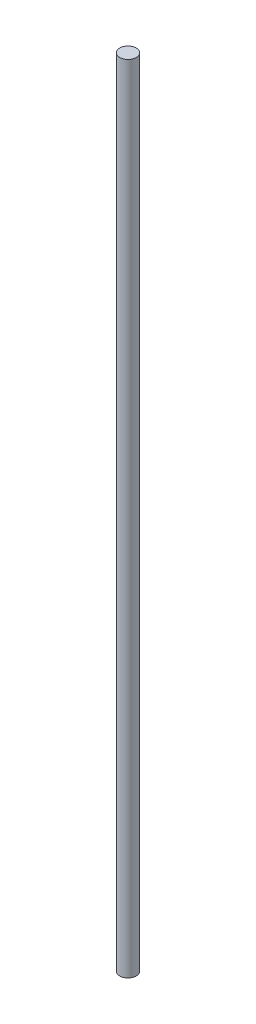
ISO-10303-21;
HEADER;
FILE_DESCRIPTION(('STEP AP214'),'2;1');
FILE_NAME('part.step','',(''),(''),'','','');
FILE_SCHEMA(('AUTOMOTIVE_DESIGN { 1 0 10303 214 1 1 1 1 }'));
ENDSEC;
DATA;
#1=APPLICATION_CONTEXT('core data for automotive mechanical design processes');
#2=APPLICATION_PROTOCOL_DEFINITION('international standard','automotive_design',2000,#1);
#3=PRODUCT_CONTEXT('',#1,'mechanical');
#4=PRODUCT('Part','Part','',(#3));
#5=PRODUCT_RELATED_PRODUCT_CATEGORY('part','',(#4));
#6=PRODUCT_DEFINITION_FORMATION('','',#4);
#7=PRODUCT_DEFINITION_CONTEXT('part definition',#1,'design');
#8=PRODUCT_DEFINITION('design','',#6,#7);
#9=PRODUCT_DEFINITION_SHAPE('','',#8);
#10=(LENGTH_UNIT() NAMED_UNIT(*) SI_UNIT(.MILLI.,.METRE.));
#11=(NAMED_UNIT(*) PLANE_ANGLE_UNIT() SI_UNIT($,.RADIAN.));
#12=(NAMED_UNIT(*) SI_UNIT($,.STERADIAN.) SOLID_ANGLE_UNIT());
#13=UNCERTAINTY_MEASURE_WITH_UNIT(LENGTH_MEASURE(1.E-05),#10,'distance_accuracy_value','');
#14=(GEOMETRIC_REPRESENTATION_CONTEXT(3) GLOBAL_UNCERTAINTY_ASSIGNED_CONTEXT((#13)) GLOBAL_UNIT_ASSIGNED_CONTEXT((#10,
#11,#12)) REPRESENTATION_CONTEXT('',''));
#15=CARTESIAN_POINT('',(0.,0.,0.));
#16=DIRECTION('',(0.,0.,1.));
#17=DIRECTION('',(1.,0.,0.));
#18=AXIS2_PLACEMENT_3D('',#15,#16,#17);
#19=CARTESIAN_POINT('',(0.,385.75,0.));
#20=DIRECTION('',(0.,-1.,0.));
#21=DIRECTION('',(0.,0.,-1.));
#22=AXIS2_PLACEMENT_3D('',#19,#20,#21);
#23=CYLINDRICAL_SURFACE('',#22,4.);
#24=CARTESIAN_POINT('',(0.,385.75,0.));
#25=DIRECTION('',(0.,1.,0.));
#26=DIRECTION('',(0.,0.,1.));
#27=AXIS2_PLACEMENT_3D('',#24,#25,#26);
#28=CIRCLE('',#27,4.);
#29=CARTESIAN_POINT('',(0.,385.75,4.));
#30=VERTEX_POINT('',#29);
#31=EDGE_CURVE('E10',#30,#30,#28,.T.);
#32=ORIENTED_EDGE('',*,*,#31,.F.);
#33=EDGE_LOOP('',(#32));
#34=FACE_BOUND('',#33,.T.);
#35=CARTESIAN_POINT('',(0.,0.,0.));
#36=DIRECTION('',(0.,1.,0.));
#37=DIRECTION('',(0.,0.,1.));
#38=AXIS2_PLACEMENT_3D('',#35,#36,#37);
#39=CIRCLE('',#38,4.);
#40=CARTESIAN_POINT('',(0.,0.,4.));
#41=VERTEX_POINT('',#40);
#42=EDGE_CURVE('E36',#41,#41,#39,.T.);
#43=ORIENTED_EDGE('',*,*,#42,.T.);
#44=EDGE_LOOP('',(#43));
#45=FACE_BOUND('',#44,.T.);
#46=ADVANCED_FACE('F33',(#34,#45),#23,.T.);
#47=CARTESIAN_POINT('',(0.,385.75,0.));
#48=DIRECTION('',(0.,1.,0.));
#49=DIRECTION('',(0.,0.,1.));
#50=AXIS2_PLACEMENT_3D('',#47,#48,#49);
#51=PLANE('',#50);
#52=ORIENTED_EDGE('',*,*,#31,.T.);
#53=EDGE_LOOP('',(#52));
#54=FACE_BOUND('',#53,.T.);
#55=ADVANCED_FACE('F48',(#54),#51,.T.);
#56=CARTESIAN_POINT('',(0.,0.,0.));
#57=DIRECTION('',(0.,1.,0.));
#58=DIRECTION('',(0.,0.,1.));
#59=AXIS2_PLACEMENT_3D('',#56,#57,#58);
#60=PLANE('',#59);
#61=ORIENTED_EDGE('',*,*,#42,.F.);
#62=EDGE_LOOP('',(#61));
#63=FACE_BOUND('',#62,.T.);
#64=ADVANCED_FACE('F46',(#63),#60,.F.);
#65=CLOSED_SHELL('',(#46,#55,#64));
#66=MANIFOLD_SOLID_BREP('B2',#65);
#67=ADVANCED_BREP_SHAPE_REPRESENTATION('',(#18,#66),#14);
#68=SHAPE_DEFINITION_REPRESENTATION(#9,#67);
ENDSEC;
END-ISO-10303-21;
